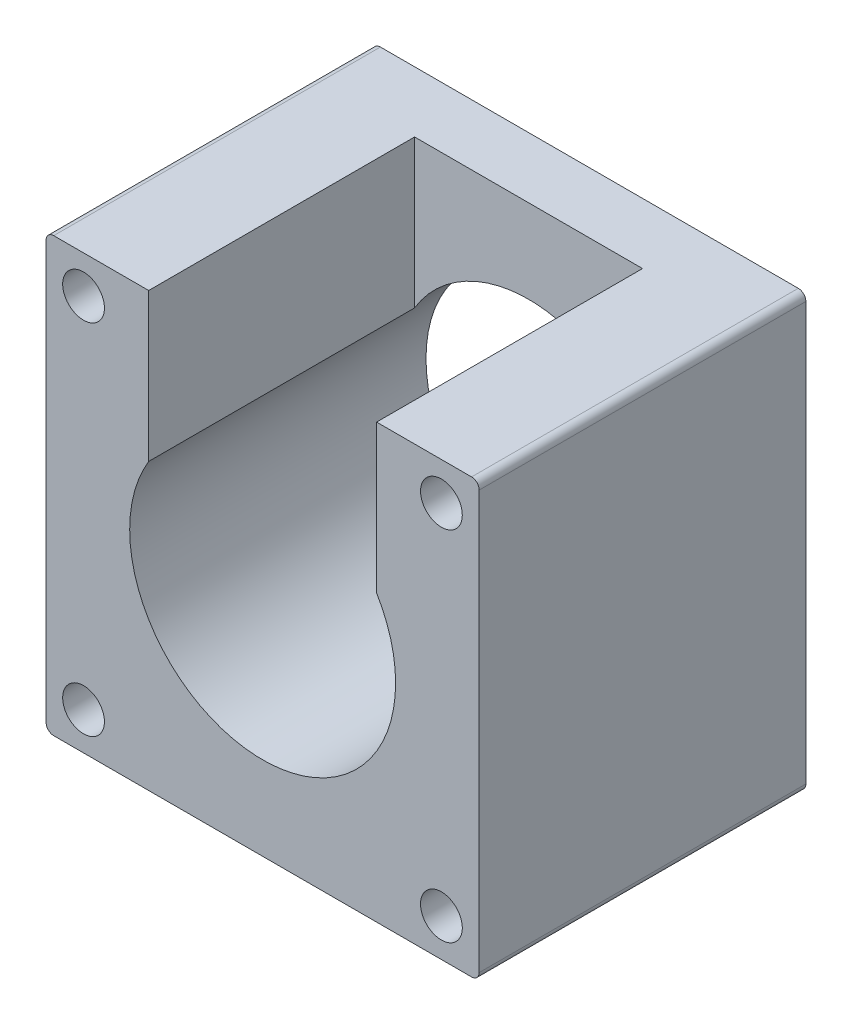
ISO-10303-21;
HEADER;
FILE_DESCRIPTION(('STEP AP214'),'2;1');
FILE_NAME('part.step','',(''),(''),'','','');
FILE_SCHEMA(('AUTOMOTIVE_DESIGN { 1 0 10303 214 1 1 1 1 }'));
ENDSEC;
DATA;
#1=APPLICATION_CONTEXT('core data for automotive mechanical design processes');
#2=APPLICATION_PROTOCOL_DEFINITION('international standard','automotive_design',2000,#1);
#3=PRODUCT_CONTEXT('',#1,'mechanical');
#4=PRODUCT('Part','Part','',(#3));
#5=PRODUCT_RELATED_PRODUCT_CATEGORY('part','',(#4));
#6=PRODUCT_DEFINITION_FORMATION('','',#4);
#7=PRODUCT_DEFINITION_CONTEXT('part definition',#1,'design');
#8=PRODUCT_DEFINITION('design','',#6,#7);
#9=PRODUCT_DEFINITION_SHAPE('','',#8);
#10=(LENGTH_UNIT() NAMED_UNIT(*) SI_UNIT(.MILLI.,.METRE.));
#11=(NAMED_UNIT(*) PLANE_ANGLE_UNIT() SI_UNIT($,.RADIAN.));
#12=(NAMED_UNIT(*) SI_UNIT($,.STERADIAN.) SOLID_ANGLE_UNIT());
#13=UNCERTAINTY_MEASURE_WITH_UNIT(LENGTH_MEASURE(1.E-05),#10,'distance_accuracy_value','');
#14=(GEOMETRIC_REPRESENTATION_CONTEXT(3) GLOBAL_UNCERTAINTY_ASSIGNED_CONTEXT((#13)) GLOBAL_UNIT_ASSIGNED_CONTEXT((#10,
#11,#12)) REPRESENTATION_CONTEXT('',''));
#15=CARTESIAN_POINT('',(0.,0.,0.));
#16=DIRECTION('',(0.,0.,1.));
#17=DIRECTION('',(1.,0.,0.));
#18=AXIS2_PLACEMENT_3D('',#15,#16,#17);
#19=CARTESIAN_POINT('',(28.5,28.5,43.));
#20=DIRECTION('',(0.,0.,-1.));
#21=DIRECTION('',(-1.,0.,0.));
#22=AXIS2_PLACEMENT_3D('',#19,#20,#21);
#23=CYLINDRICAL_SURFACE('',#22,17.5);
#24=DIRECTION('',(0.,0.,-1.));
#25=VECTOR('',#24,1.);
#26=CARTESIAN_POINT('',(13.5,37.51387818866,43.));
#27=LINE('',#26,#25);
#28=CARTESIAN_POINT('',(13.5,37.51387818866,43.));
#29=VERTEX_POINT('',#28);
#30=CARTESIAN_POINT('',(13.5,37.51387818866,7.99999999999999));
#31=VERTEX_POINT('',#30);
#32=EDGE_CURVE('E11',#29,#31,#27,.T.);
#33=ORIENTED_EDGE('',*,*,#32,.F.);
#34=CARTESIAN_POINT('',(28.5,28.5,43.));
#35=DIRECTION('',(0.,0.,1.));
#36=DIRECTION('',(1.,0.,0.));
#37=AXIS2_PLACEMENT_3D('',#34,#35,#36);
#38=CIRCLE('',#37,17.5);
#39=CARTESIAN_POINT('',(43.5,37.51387818866,43.));
#40=VERTEX_POINT('',#39);
#41=EDGE_CURVE('E148',#29,#40,#38,.T.);
#42=ORIENTED_EDGE('',*,*,#41,.T.);
#43=DIRECTION('',(0.,0.,-1.));
#44=VECTOR('',#43,1.);
#45=CARTESIAN_POINT('',(43.5,37.51387818866,43.));
#46=LINE('',#45,#44);
#47=CARTESIAN_POINT('',(43.5,37.51387818866,7.99999999999999));
#48=VERTEX_POINT('',#47);
#49=EDGE_CURVE('E175',#48,#40,#46,.F.);
#50=ORIENTED_EDGE('',*,*,#49,.F.);
#51=CARTESIAN_POINT('',(28.5,28.5,7.99999999999999));
#52=DIRECTION('',(0.,0.,-1.));
#53=DIRECTION('',(-1.,0.,0.));
#54=AXIS2_PLACEMENT_3D('',#51,#52,#53);
#55=CIRCLE('',#54,17.5);
#56=EDGE_CURVE('E41',#31,#48,#55,.T.);
#57=ORIENTED_EDGE('',*,*,#56,.F.);
#58=EDGE_LOOP('',(#33,#42,#50,#57));
#59=FACE_BOUND('',#58,.T.);
#60=CARTESIAN_POINT('',(28.5,28.5,4.));
#61=DIRECTION('',(0.,0.,-1.));
#62=DIRECTION('',(-1.,0.,0.));
#63=AXIS2_PLACEMENT_3D('',#60,#61,#62);
#64=CIRCLE('',#63,17.5);
#65=CARTESIAN_POINT('',(11.,28.5,4.));
#66=VERTEX_POINT('',#65);
#67=EDGE_CURVE('E36',#66,#66,#64,.T.);
#68=ORIENTED_EDGE('',*,*,#67,.T.);
#69=EDGE_LOOP('',(#68));
#70=FACE_BOUND('',#69,.T.);
#71=ADVANCED_FACE('F32',(#59,#70),#23,.F.);
#72=CARTESIAN_POINT('',(56.,1.,43.));
#73=DIRECTION('',(0.,0.,1.));
#74=DIRECTION('',(1.,0.,0.));
#75=AXIS2_PLACEMENT_3D('',#72,#73,#74);
#76=PLANE('',#75);
#77=DIRECTION('',(0.,1.,0.));
#78=VECTOR('',#77,1.);
#79=CARTESIAN_POINT('',(13.5,27.,43.));
#80=LINE('',#79,#78);
#81=CARTESIAN_POINT('',(13.5,57.,43.));
#82=VERTEX_POINT('',#81);
#83=EDGE_CURVE('E202',#29,#82,#80,.T.);
#84=ORIENTED_EDGE('',*,*,#83,.T.);
#85=DIRECTION('',(-1.,0.,0.));
#86=VECTOR('',#85,1.);
#87=CARTESIAN_POINT('',(1.,57.,43.));
#88=LINE('',#87,#86);
#89=CARTESIAN_POINT('',(1.,57.,43.));
#90=VERTEX_POINT('',#89);
#91=EDGE_CURVE('E238',#82,#90,#88,.T.);
#92=ORIENTED_EDGE('',*,*,#91,.T.);
#93=CARTESIAN_POINT('',(0.999999999999993,56.,43.));
#94=DIRECTION('',(0.,0.,1.));
#95=DIRECTION('',(-1.,0.,0.));
#96=AXIS2_PLACEMENT_3D('',#93,#94,#95);
#97=CIRCLE('',#96,1.);
#98=CARTESIAN_POINT('',(0.,56.,43.));
#99=VERTEX_POINT('',#98);
#100=EDGE_CURVE('E123',#90,#99,#97,.T.);
#101=ORIENTED_EDGE('',*,*,#100,.T.);
#102=DIRECTION('',(0.,-1.,0.));
#103=VECTOR('',#102,1.);
#104=CARTESIAN_POINT('',(0.,1.00000000000001,43.));
#105=LINE('',#104,#103);
#106=CARTESIAN_POINT('',(0.,1.00000000000001,43.));
#107=VERTEX_POINT('',#106);
#108=EDGE_CURVE('E114',#99,#107,#105,.T.);
#109=ORIENTED_EDGE('',*,*,#108,.T.);
#110=CARTESIAN_POINT('',(1.,1.,43.));
#111=DIRECTION('',(0.,0.,1.));
#112=DIRECTION('',(-1.,0.,0.));
#113=AXIS2_PLACEMENT_3D('',#110,#111,#112);
#114=CIRCLE('',#113,1.);
#115=CARTESIAN_POINT('',(1.00000000000001,0.,43.));
#116=VERTEX_POINT('',#115);
#117=EDGE_CURVE('E120',#107,#116,#114,.T.);
#118=ORIENTED_EDGE('',*,*,#117,.T.);
#119=DIRECTION('',(1.,0.,0.));
#120=VECTOR('',#119,1.);
#121=CARTESIAN_POINT('',(1.00000000000001,0.,43.));
#122=LINE('',#121,#120);
#123=CARTESIAN_POINT('',(56.,0.,43.));
#124=VERTEX_POINT('',#123);
#125=EDGE_CURVE('E57',#116,#124,#122,.T.);
#126=ORIENTED_EDGE('',*,*,#125,.T.);
#127=CARTESIAN_POINT('',(56.,1.,43.));
#128=DIRECTION('',(0.,0.,1.));
#129=DIRECTION('',(1.,0.,0.));
#130=AXIS2_PLACEMENT_3D('',#127,#128,#129);
#131=CIRCLE('',#130,1.);
#132=CARTESIAN_POINT('',(57.,1.00000000000001,43.));
#133=VERTEX_POINT('',#132);
#134=EDGE_CURVE('E160',#124,#133,#131,.T.);
#135=ORIENTED_EDGE('',*,*,#134,.T.);
#136=DIRECTION('',(0.,1.,0.));
#137=VECTOR('',#136,1.);
#138=CARTESIAN_POINT('',(57.,1.00000000000001,43.));
#139=LINE('',#138,#137);
#140=CARTESIAN_POINT('',(57.,56.,43.));
#141=VERTEX_POINT('',#140);
#142=EDGE_CURVE('E99',#133,#141,#139,.T.);
#143=ORIENTED_EDGE('',*,*,#142,.T.);
#144=CARTESIAN_POINT('',(56.,56.,43.));
#145=DIRECTION('',(0.,0.,1.));
#146=DIRECTION('',(-1.,0.,0.));
#147=AXIS2_PLACEMENT_3D('',#144,#145,#146);
#148=CIRCLE('',#147,1.);
#149=CARTESIAN_POINT('',(56.,57.,43.));
#150=VERTEX_POINT('',#149);
#151=EDGE_CURVE('E236',#141,#150,#148,.T.);
#152=ORIENTED_EDGE('',*,*,#151,.T.);
#153=CARTESIAN_POINT('',(43.5,57.,43.));
#154=VERTEX_POINT('',#153);
#155=EDGE_CURVE('E201',#150,#154,#88,.T.);
#156=ORIENTED_EDGE('',*,*,#155,.T.);
#157=DIRECTION('',(0.,1.,0.));
#158=VECTOR('',#157,1.);
#159=CARTESIAN_POINT('',(43.5,27.,43.));
#160=LINE('',#159,#158);
#161=EDGE_CURVE('E196',#40,#154,#160,.T.);
#162=ORIENTED_EDGE('',*,*,#161,.F.);
#163=ORIENTED_EDGE('',*,*,#41,.F.);
#164=EDGE_LOOP('',(#84,#92,#101,#109,#118,#126,#135,#143,#152,#156,#162,#163));
#165=FACE_BOUND('',#164,.T.);
#166=CARTESIAN_POINT('',(4.92665558238845,4.92665558238847,43.));
#167=DIRECTION('',(0.,0.,1.));
#168=DIRECTION('',(-1.,0.,0.));
#169=AXIS2_PLACEMENT_3D('',#166,#167,#168);
#170=CIRCLE('',#169,2.75);
#171=CARTESIAN_POINT('',(2.17665558238845,4.92665558238847,43.));
#172=VERTEX_POINT('',#171);
#173=EDGE_CURVE('E216',#172,#172,#170,.T.);
#174=ORIENTED_EDGE('',*,*,#173,.F.);
#175=EDGE_LOOP('',(#174));
#176=FACE_BOUND('',#175,.T.);
#177=CARTESIAN_POINT('',(4.92665558238845,52.0733444176115,43.));
#178=DIRECTION('',(0.,0.,1.));
#179=DIRECTION('',(1.,0.,0.));
#180=AXIS2_PLACEMENT_3D('',#177,#178,#179);
#181=CIRCLE('',#180,2.75);
#182=CARTESIAN_POINT('',(7.67665558238845,52.0733444176115,43.));
#183=VERTEX_POINT('',#182);
#184=EDGE_CURVE('E228',#183,#183,#181,.T.);
#185=ORIENTED_EDGE('',*,*,#184,.F.);
#186=EDGE_LOOP('',(#185));
#187=FACE_BOUND('',#186,.T.);
#188=CARTESIAN_POINT('',(52.0266324187858,52.0266324187858,43.));
#189=DIRECTION('',(0.,0.,1.));
#190=DIRECTION('',(1.,0.,0.));
#191=AXIS2_PLACEMENT_3D('',#188,#189,#190);
#192=CIRCLE('',#191,2.75);
#193=CARTESIAN_POINT('',(54.7766324187858,52.0266324187858,43.));
#194=VERTEX_POINT('',#193);
#195=EDGE_CURVE('E222',#194,#194,#192,.T.);
#196=ORIENTED_EDGE('',*,*,#195,.F.);
#197=EDGE_LOOP('',(#196));
#198=FACE_BOUND('',#197,.T.);
#199=CARTESIAN_POINT('',(52.0266324187858,4.97336758121422,43.));
#200=DIRECTION('',(0.,0.,1.));
#201=DIRECTION('',(-1.,0.,0.));
#202=AXIS2_PLACEMENT_3D('',#199,#200,#201);
#203=CIRCLE('',#202,2.75);
#204=CARTESIAN_POINT('',(49.2766324187858,4.97336758121422,43.));
#205=VERTEX_POINT('',#204);
#206=EDGE_CURVE('E209',#205,#205,#203,.T.);
#207=ORIENTED_EDGE('',*,*,#206,.F.);
#208=EDGE_LOOP('',(#207));
#209=FACE_BOUND('',#208,.T.);
#210=ADVANCED_FACE('F117',(#165,#176,#187,#198,#209),#76,.T.);
#211=CARTESIAN_POINT('',(56.,1.,0.));
#212=DIRECTION('',(0.,0.,1.));
#213=DIRECTION('',(1.,0.,0.));
#214=AXIS2_PLACEMENT_3D('',#211,#212,#213);
#215=PLANE('',#214);
#216=CARTESIAN_POINT('',(28.5,28.5,0.));
#217=DIRECTION('',(0.,0.,-1.));
#218=DIRECTION('',(-1.,0.,0.));
#219=AXIS2_PLACEMENT_3D('',#216,#217,#218);
#220=CIRCLE('',#219,22.5);
#221=CARTESIAN_POINT('',(5.99999999999999,28.5,0.));
#222=VERTEX_POINT('',#221);
#223=EDGE_CURVE('E393',#222,#222,#220,.T.);
#224=ORIENTED_EDGE('',*,*,#223,.F.);
#225=EDGE_LOOP('',(#224));
#226=FACE_BOUND('',#225,.T.);
#227=CARTESIAN_POINT('',(4.92665558238845,4.92665558238847,0.));
#228=DIRECTION('',(0.,0.,1.));
#229=DIRECTION('',(-1.,0.,0.));
#230=AXIS2_PLACEMENT_3D('',#227,#228,#229);
#231=CIRCLE('',#230,2.75);
#232=CARTESIAN_POINT('',(2.17665558238845,4.92665558238847,0.));
#233=VERTEX_POINT('',#232);
#234=EDGE_CURVE('E212',#233,#233,#231,.T.);
#235=ORIENTED_EDGE('',*,*,#234,.T.);
#236=EDGE_LOOP('',(#235));
#237=FACE_BOUND('',#236,.T.);
#238=CARTESIAN_POINT('',(4.92665558238845,52.0733444176115,0.));
#239=DIRECTION('',(0.,0.,1.));
#240=DIRECTION('',(1.,0.,0.));
#241=AXIS2_PLACEMENT_3D('',#238,#239,#240);
#242=CIRCLE('',#241,2.75);
#243=CARTESIAN_POINT('',(7.67665558238845,52.0733444176115,0.));
#244=VERTEX_POINT('',#243);
#245=EDGE_CURVE('E225',#244,#244,#242,.T.);
#246=ORIENTED_EDGE('',*,*,#245,.T.);
#247=EDGE_LOOP('',(#246));
#248=FACE_BOUND('',#247,.T.);
#249=CARTESIAN_POINT('',(56.,1.,0.));
#250=DIRECTION('',(0.,0.,1.));
#251=DIRECTION('',(1.,0.,0.));
#252=AXIS2_PLACEMENT_3D('',#249,#250,#251);
#253=CIRCLE('',#252,1.);
#254=CARTESIAN_POINT('',(56.,0.,0.));
#255=VERTEX_POINT('',#254);
#256=CARTESIAN_POINT('',(57.,1.00000000000001,0.));
#257=VERTEX_POINT('',#256);
#258=EDGE_CURVE('E144',#255,#257,#253,.T.);
#259=ORIENTED_EDGE('',*,*,#258,.F.);
#260=DIRECTION('',(1.,0.,0.));
#261=VECTOR('',#260,1.);
#262=CARTESIAN_POINT('',(1.00000000000001,0.,0.));
#263=LINE('',#262,#261);
#264=CARTESIAN_POINT('',(1.00000000000001,0.,0.));
#265=VERTEX_POINT('',#264);
#266=EDGE_CURVE('E90',#265,#255,#263,.T.);
#267=ORIENTED_EDGE('',*,*,#266,.F.);
#268=CARTESIAN_POINT('',(1.,1.,0.));
#269=DIRECTION('',(0.,0.,1.));
#270=DIRECTION('',(-1.,0.,0.));
#271=AXIS2_PLACEMENT_3D('',#268,#269,#270);
#272=CIRCLE('',#271,1.);
#273=CARTESIAN_POINT('',(0.,1.00000000000001,0.));
#274=VERTEX_POINT('',#273);
#275=EDGE_CURVE('E157',#274,#265,#272,.T.);
#276=ORIENTED_EDGE('',*,*,#275,.F.);
#277=DIRECTION('',(0.,-1.,0.));
#278=VECTOR('',#277,1.);
#279=CARTESIAN_POINT('',(0.,1.00000000000001,0.));
#280=LINE('',#279,#278);
#281=CARTESIAN_POINT('',(0.,56.,0.));
#282=VERTEX_POINT('',#281);
#283=EDGE_CURVE('E132',#282,#274,#280,.T.);
#284=ORIENTED_EDGE('',*,*,#283,.F.);
#285=CARTESIAN_POINT('',(0.999999999999993,56.,0.));
#286=DIRECTION('',(0.,0.,1.));
#287=DIRECTION('',(-1.,0.,0.));
#288=AXIS2_PLACEMENT_3D('',#285,#286,#287);
#289=CIRCLE('',#288,1.);
#290=CARTESIAN_POINT('',(1.,57.,0.));
#291=VERTEX_POINT('',#290);
#292=EDGE_CURVE('E154',#291,#282,#289,.T.);
#293=ORIENTED_EDGE('',*,*,#292,.F.);
#294=DIRECTION('',(-1.,0.,0.));
#295=VECTOR('',#294,1.);
#296=CARTESIAN_POINT('',(1.,57.,0.));
#297=LINE('',#296,#295);
#298=CARTESIAN_POINT('',(56.,57.,0.));
#299=VERTEX_POINT('',#298);
#300=EDGE_CURVE('E152',#299,#291,#297,.T.);
#301=ORIENTED_EDGE('',*,*,#300,.F.);
#302=CARTESIAN_POINT('',(56.,56.,0.));
#303=DIRECTION('',(0.,0.,1.));
#304=DIRECTION('',(-1.,0.,0.));
#305=AXIS2_PLACEMENT_3D('',#302,#303,#304);
#306=CIRCLE('',#305,1.);
#307=CARTESIAN_POINT('',(57.,56.,0.));
#308=VERTEX_POINT('',#307);
#309=EDGE_CURVE('E150',#308,#299,#306,.T.);
#310=ORIENTED_EDGE('',*,*,#309,.F.);
#311=DIRECTION('',(0.,1.,0.));
#312=VECTOR('',#311,1.);
#313=CARTESIAN_POINT('',(57.,1.00000000000001,0.));
#314=LINE('',#313,#312);
#315=EDGE_CURVE('E147',#257,#308,#314,.T.);
#316=ORIENTED_EDGE('',*,*,#315,.F.);
#317=EDGE_LOOP('',(#259,#267,#276,#284,#293,#301,#310,#316));
#318=FACE_BOUND('',#317,.T.);
#319=CARTESIAN_POINT('',(52.0266324187858,52.0266324187858,0.));
#320=DIRECTION('',(0.,0.,1.));
#321=DIRECTION('',(1.,0.,0.));
#322=AXIS2_PLACEMENT_3D('',#319,#320,#321);
#323=CIRCLE('',#322,2.75);
#324=CARTESIAN_POINT('',(54.7766324187858,52.0266324187858,0.));
#325=VERTEX_POINT('',#324);
#326=EDGE_CURVE('E219',#325,#325,#323,.T.);
#327=ORIENTED_EDGE('',*,*,#326,.T.);
#328=EDGE_LOOP('',(#327));
#329=FACE_BOUND('',#328,.T.);
#330=CARTESIAN_POINT('',(52.0266324187858,4.97336758121422,0.));
#331=DIRECTION('',(0.,0.,1.));
#332=DIRECTION('',(-1.,0.,0.));
#333=AXIS2_PLACEMENT_3D('',#330,#331,#332);
#334=CIRCLE('',#333,2.75);
#335=CARTESIAN_POINT('',(49.2766324187858,4.97336758121422,0.));
#336=VERTEX_POINT('',#335);
#337=EDGE_CURVE('E213',#336,#336,#334,.T.);
#338=ORIENTED_EDGE('',*,*,#337,.T.);
#339=EDGE_LOOP('',(#338));
#340=FACE_BOUND('',#339,.T.);
#341=ADVANCED_FACE('F252',(#226,#237,#248,#318,#329,#340),#215,.F.);
#342=CARTESIAN_POINT('',(56.,1.,43.));
#343=DIRECTION('',(0.,0.,-1.));
#344=DIRECTION('',(-1.,0.,0.));
#345=AXIS2_PLACEMENT_3D('',#342,#343,#344);
#346=CYLINDRICAL_SURFACE('',#345,1.);
#347=ORIENTED_EDGE('',*,*,#258,.T.);
#348=DIRECTION('',(0.,0.,-1.));
#349=VECTOR('',#348,1.);
#350=CARTESIAN_POINT('',(57.,1.00000000000001,43.));
#351=LINE('',#350,#349);
#352=EDGE_CURVE('E173',#133,#257,#351,.T.);
#353=ORIENTED_EDGE('',*,*,#352,.F.);
#354=ORIENTED_EDGE('',*,*,#134,.F.);
#355=DIRECTION('',(0.,0.,-1.));
#356=VECTOR('',#355,1.);
#357=CARTESIAN_POINT('',(56.,0.,43.));
#358=LINE('',#357,#356);
#359=EDGE_CURVE('E140',#124,#255,#358,.T.);
#360=ORIENTED_EDGE('',*,*,#359,.T.);
#361=EDGE_LOOP('',(#347,#353,#354,#360));
#362=FACE_BOUND('',#361,.T.);
#363=ADVANCED_FACE('F34',(#362),#346,.T.);
#364=CARTESIAN_POINT('',(57.,1.00000000000001,43.));
#365=DIRECTION('',(-1.,0.,0.));
#366=DIRECTION('',(0.,-1.,0.));
#367=AXIS2_PLACEMENT_3D('',#364,#365,#366);
#368=PLANE('',#367);
#369=ORIENTED_EDGE('',*,*,#315,.T.);
#370=DIRECTION('',(0.,0.,-1.));
#371=VECTOR('',#370,1.);
#372=CARTESIAN_POINT('',(57.,56.,43.));
#373=LINE('',#372,#371);
#374=EDGE_CURVE('E170',#141,#308,#373,.T.);
#375=ORIENTED_EDGE('',*,*,#374,.F.);
#376=ORIENTED_EDGE('',*,*,#142,.F.);
#377=ORIENTED_EDGE('',*,*,#352,.T.);
#378=EDGE_LOOP('',(#369,#375,#376,#377));
#379=FACE_BOUND('',#378,.T.);
#380=ADVANCED_FACE('F260',(#379),#368,.F.);
#381=CARTESIAN_POINT('',(56.,56.,43.));
#382=DIRECTION('',(0.,0.,-1.));
#383=DIRECTION('',(-1.,0.,0.));
#384=AXIS2_PLACEMENT_3D('',#381,#382,#383);
#385=CYLINDRICAL_SURFACE('',#384,1.);
#386=ORIENTED_EDGE('',*,*,#309,.T.);
#387=DIRECTION('',(0.,0.,-1.));
#388=VECTOR('',#387,1.);
#389=CARTESIAN_POINT('',(56.,57.,43.));
#390=LINE('',#389,#388);
#391=EDGE_CURVE('E167',#150,#299,#390,.T.);
#392=ORIENTED_EDGE('',*,*,#391,.F.);
#393=ORIENTED_EDGE('',*,*,#151,.F.);
#394=ORIENTED_EDGE('',*,*,#374,.T.);
#395=EDGE_LOOP('',(#386,#392,#393,#394));
#396=FACE_BOUND('',#395,.T.);
#397=ADVANCED_FACE('F263',(#396),#385,.T.);
#398=CARTESIAN_POINT('',(1.,57.,43.));
#399=DIRECTION('',(0.,-1.,0.));
#400=DIRECTION('',(0.,0.,-1.));
#401=AXIS2_PLACEMENT_3D('',#398,#399,#400);
#402=PLANE('',#401);
#403=ORIENTED_EDGE('',*,*,#91,.F.);
#404=DIRECTION('',(0.,0.,1.));
#405=VECTOR('',#404,1.);
#406=CARTESIAN_POINT('',(13.5,57.,43.));
#407=LINE('',#406,#405);
#408=CARTESIAN_POINT('',(13.5,57.,7.99999999999999));
#409=VERTEX_POINT('',#408);
#410=EDGE_CURVE('E267',#409,#82,#407,.T.);
#411=ORIENTED_EDGE('',*,*,#410,.F.);
#412=DIRECTION('',(-1.,0.,0.));
#413=VECTOR('',#412,1.);
#414=CARTESIAN_POINT('',(13.5,57.,7.99999999999999));
#415=LINE('',#414,#413);
#416=CARTESIAN_POINT('',(43.5,57.,7.99999999999999));
#417=VERTEX_POINT('',#416);
#418=EDGE_CURVE('E205',#417,#409,#415,.T.);
#419=ORIENTED_EDGE('',*,*,#418,.F.);
#420=DIRECTION('',(0.,0.,-1.));
#421=VECTOR('',#420,1.);
#422=CARTESIAN_POINT('',(43.5,57.,43.));
#423=LINE('',#422,#421);
#424=EDGE_CURVE('E265',#154,#417,#423,.T.);
#425=ORIENTED_EDGE('',*,*,#424,.F.);
#426=ORIENTED_EDGE('',*,*,#155,.F.);
#427=ORIENTED_EDGE('',*,*,#391,.T.);
#428=ORIENTED_EDGE('',*,*,#300,.T.);
#429=DIRECTION('',(0.,0.,-1.));
#430=VECTOR('',#429,1.);
#431=CARTESIAN_POINT('',(1.,57.,43.));
#432=LINE('',#431,#430);
#433=EDGE_CURVE('E164',#90,#291,#432,.T.);
#434=ORIENTED_EDGE('',*,*,#433,.F.);
#435=EDGE_LOOP('',(#403,#411,#419,#425,#426,#427,#428,#434));
#436=FACE_BOUND('',#435,.T.);
#437=ADVANCED_FACE('F245',(#436),#402,.F.);
#438=CARTESIAN_POINT('',(0.999999999999993,56.,43.));
#439=DIRECTION('',(0.,0.,-1.));
#440=DIRECTION('',(-1.,0.,0.));
#441=AXIS2_PLACEMENT_3D('',#438,#439,#440);
#442=CYLINDRICAL_SURFACE('',#441,1.);
#443=ORIENTED_EDGE('',*,*,#292,.T.);
#444=DIRECTION('',(0.,0.,-1.));
#445=VECTOR('',#444,1.);
#446=CARTESIAN_POINT('',(0.,56.,43.));
#447=LINE('',#446,#445);
#448=EDGE_CURVE('E135',#99,#282,#447,.T.);
#449=ORIENTED_EDGE('',*,*,#448,.F.);
#450=ORIENTED_EDGE('',*,*,#100,.F.);
#451=ORIENTED_EDGE('',*,*,#433,.T.);
#452=EDGE_LOOP('',(#443,#449,#450,#451));
#453=FACE_BOUND('',#452,.T.);
#454=ADVANCED_FACE('F249',(#453),#442,.T.);
#455=CARTESIAN_POINT('',(0.,1.00000000000001,43.));
#456=DIRECTION('',(1.,0.,0.));
#457=DIRECTION('',(0.,1.,0.));
#458=AXIS2_PLACEMENT_3D('',#455,#456,#457);
#459=PLANE('',#458);
#460=ORIENTED_EDGE('',*,*,#283,.T.);
#461=DIRECTION('',(0.,0.,-1.));
#462=VECTOR('',#461,1.);
#463=CARTESIAN_POINT('',(0.,1.00000000000001,43.));
#464=LINE('',#463,#462);
#465=EDGE_CURVE('E129',#107,#274,#464,.T.);
#466=ORIENTED_EDGE('',*,*,#465,.F.);
#467=ORIENTED_EDGE('',*,*,#108,.F.);
#468=ORIENTED_EDGE('',*,*,#448,.T.);
#469=EDGE_LOOP('',(#460,#466,#467,#468));
#470=FACE_BOUND('',#469,.T.);
#471=ADVANCED_FACE('F130',(#470),#459,.F.);
#472=CARTESIAN_POINT('',(1.,1.,43.));
#473=DIRECTION('',(0.,0.,-1.));
#474=DIRECTION('',(-1.,0.,0.));
#475=AXIS2_PLACEMENT_3D('',#472,#473,#474);
#476=CYLINDRICAL_SURFACE('',#475,1.);
#477=ORIENTED_EDGE('',*,*,#275,.T.);
#478=DIRECTION('',(0.,0.,-1.));
#479=VECTOR('',#478,1.);
#480=CARTESIAN_POINT('',(1.00000000000001,0.,43.));
#481=LINE('',#480,#479);
#482=EDGE_CURVE('E136',#116,#265,#481,.T.);
#483=ORIENTED_EDGE('',*,*,#482,.F.);
#484=ORIENTED_EDGE('',*,*,#117,.F.);
#485=ORIENTED_EDGE('',*,*,#465,.T.);
#486=EDGE_LOOP('',(#477,#483,#484,#485));
#487=FACE_BOUND('',#486,.T.);
#488=ADVANCED_FACE('F138',(#487),#476,.T.);
#489=CARTESIAN_POINT('',(1.00000000000001,0.,43.));
#490=DIRECTION('',(0.,1.,0.));
#491=DIRECTION('',(0.,0.,1.));
#492=AXIS2_PLACEMENT_3D('',#489,#490,#491);
#493=PLANE('',#492);
#494=ORIENTED_EDGE('',*,*,#266,.T.);
#495=ORIENTED_EDGE('',*,*,#359,.F.);
#496=ORIENTED_EDGE('',*,*,#125,.F.);
#497=ORIENTED_EDGE('',*,*,#482,.T.);
#498=EDGE_LOOP('',(#494,#495,#496,#497));
#499=FACE_BOUND('',#498,.T.);
#500=ADVANCED_FACE('F254',(#499),#493,.F.);
#501=CARTESIAN_POINT('',(4.92665558238845,52.0733444176115,43.));
#502=DIRECTION('',(0.,0.,-1.));
#503=DIRECTION('',(-1.,0.,0.));
#504=AXIS2_PLACEMENT_3D('',#501,#502,#503);
#505=CYLINDRICAL_SURFACE('',#504,2.75);
#506=ORIENTED_EDGE('',*,*,#184,.T.);
#507=EDGE_LOOP('',(#506));
#508=FACE_BOUND('',#507,.T.);
#509=ORIENTED_EDGE('',*,*,#245,.F.);
#510=EDGE_LOOP('',(#509));
#511=FACE_BOUND('',#510,.T.);
#512=ADVANCED_FACE('F299',(#508,#511),#505,.F.);
#513=CARTESIAN_POINT('',(52.0266324187858,52.0266324187858,43.));
#514=DIRECTION('',(0.,0.,-1.));
#515=DIRECTION('',(-1.,0.,0.));
#516=AXIS2_PLACEMENT_3D('',#513,#514,#515);
#517=CYLINDRICAL_SURFACE('',#516,2.75);
#518=ORIENTED_EDGE('',*,*,#195,.T.);
#519=EDGE_LOOP('',(#518));
#520=FACE_BOUND('',#519,.T.);
#521=ORIENTED_EDGE('',*,*,#326,.F.);
#522=EDGE_LOOP('',(#521));
#523=FACE_BOUND('',#522,.T.);
#524=ADVANCED_FACE('F404',(#520,#523),#517,.F.);
#525=CARTESIAN_POINT('',(4.92665558238845,4.92665558238847,43.));
#526=DIRECTION('',(0.,0.,-1.));
#527=DIRECTION('',(-1.,0.,0.));
#528=AXIS2_PLACEMENT_3D('',#525,#526,#527);
#529=CYLINDRICAL_SURFACE('',#528,2.75);
#530=ORIENTED_EDGE('',*,*,#173,.T.);
#531=EDGE_LOOP('',(#530));
#532=FACE_BOUND('',#531,.T.);
#533=ORIENTED_EDGE('',*,*,#234,.F.);
#534=EDGE_LOOP('',(#533));
#535=FACE_BOUND('',#534,.T.);
#536=ADVANCED_FACE('F288',(#532,#535),#529,.F.);
#537=CARTESIAN_POINT('',(52.0266324187858,4.97336758121422,43.));
#538=DIRECTION('',(0.,0.,-1.));
#539=DIRECTION('',(-1.,0.,0.));
#540=AXIS2_PLACEMENT_3D('',#537,#538,#539);
#541=CYLINDRICAL_SURFACE('',#540,2.75);
#542=ORIENTED_EDGE('',*,*,#206,.T.);
#543=EDGE_LOOP('',(#542));
#544=FACE_BOUND('',#543,.T.);
#545=ORIENTED_EDGE('',*,*,#337,.F.);
#546=EDGE_LOOP('',(#545));
#547=FACE_BOUND('',#546,.T.);
#548=ADVANCED_FACE('F281',(#544,#547),#541,.F.);
#549=CARTESIAN_POINT('',(13.5,27.,43.));
#550=DIRECTION('',(-1.,0.,0.));
#551=DIRECTION('',(0.,0.,1.));
#552=AXIS2_PLACEMENT_3D('',#549,#550,#551);
#553=PLANE('',#552);
#554=ORIENTED_EDGE('',*,*,#32,.T.);
#555=DIRECTION('',(0.,1.,0.));
#556=VECTOR('',#555,1.);
#557=CARTESIAN_POINT('',(13.5,27.,7.99999999999999));
#558=LINE('',#557,#556);
#559=EDGE_CURVE('E185',#31,#409,#558,.T.);
#560=ORIENTED_EDGE('',*,*,#559,.T.);
#561=ORIENTED_EDGE('',*,*,#410,.T.);
#562=ORIENTED_EDGE('',*,*,#83,.F.);
#563=EDGE_LOOP('',(#554,#560,#561,#562));
#564=FACE_BOUND('',#563,.T.);
#565=ADVANCED_FACE('F275',(#564),#553,.F.);
#566=CARTESIAN_POINT('',(13.5,27.,7.99999999999999));
#567=DIRECTION('',(0.,0.,-1.));
#568=DIRECTION('',(-1.,0.,0.));
#569=AXIS2_PLACEMENT_3D('',#566,#567,#568);
#570=PLANE('',#569);
#571=ORIENTED_EDGE('',*,*,#56,.T.);
#572=DIRECTION('',(0.,1.,0.));
#573=VECTOR('',#572,1.);
#574=CARTESIAN_POINT('',(43.5,27.,7.99999999999999));
#575=LINE('',#574,#573);
#576=EDGE_CURVE('E48',#48,#417,#575,.T.);
#577=ORIENTED_EDGE('',*,*,#576,.T.);
#578=ORIENTED_EDGE('',*,*,#418,.T.);
#579=ORIENTED_EDGE('',*,*,#559,.F.);
#580=EDGE_LOOP('',(#571,#577,#578,#579));
#581=FACE_BOUND('',#580,.T.);
#582=ADVANCED_FACE('F181',(#581),#570,.F.);
#583=CARTESIAN_POINT('',(43.5,27.,43.));
#584=DIRECTION('',(1.,0.,0.));
#585=DIRECTION('',(0.,0.,-1.));
#586=AXIS2_PLACEMENT_3D('',#583,#584,#585);
#587=PLANE('',#586);
#588=ORIENTED_EDGE('',*,*,#49,.T.);
#589=ORIENTED_EDGE('',*,*,#161,.T.);
#590=ORIENTED_EDGE('',*,*,#424,.T.);
#591=ORIENTED_EDGE('',*,*,#576,.F.);
#592=EDGE_LOOP('',(#588,#589,#590,#591));
#593=FACE_BOUND('',#592,.T.);
#594=ADVANCED_FACE('F194',(#593),#587,.F.);
#595=CARTESIAN_POINT('',(28.5,28.5,4.));
#596=DIRECTION('',(0.,0.,-1.));
#597=DIRECTION('',(-1.,0.,0.));
#598=AXIS2_PLACEMENT_3D('',#595,#596,#597);
#599=CYLINDRICAL_SURFACE('',#598,22.5);
#600=CARTESIAN_POINT('',(28.5,28.5,4.));
#601=DIRECTION('',(0.,0.,-1.));
#602=DIRECTION('',(-1.,0.,0.));
#603=AXIS2_PLACEMENT_3D('',#600,#601,#602);
#604=CIRCLE('',#603,22.5);
#605=CARTESIAN_POINT('',(5.99999999999999,28.5,4.));
#606=VERTEX_POINT('',#605);
#607=EDGE_CURVE('E392',#606,#606,#604,.T.);
#608=ORIENTED_EDGE('',*,*,#607,.F.);
#609=EDGE_LOOP('',(#608));
#610=FACE_BOUND('',#609,.T.);
#611=ORIENTED_EDGE('',*,*,#223,.T.);
#612=EDGE_LOOP('',(#611));
#613=FACE_BOUND('',#612,.T.);
#614=ADVANCED_FACE('F361',(#610,#613),#599,.F.);
#615=CARTESIAN_POINT('',(28.5,28.5,4.));
#616=DIRECTION('',(0.,0.,-1.));
#617=DIRECTION('',(-1.,0.,0.));
#618=AXIS2_PLACEMENT_3D('',#615,#616,#617);
#619=PLANE('',#618);
#620=ORIENTED_EDGE('',*,*,#67,.F.);
#621=EDGE_LOOP('',(#620));
#622=FACE_BOUND('',#621,.T.);
#623=ORIENTED_EDGE('',*,*,#607,.T.);
#624=EDGE_LOOP('',(#623));
#625=FACE_BOUND('',#624,.T.);
#626=ADVANCED_FACE('F374',(#622,#625),#619,.T.);
#627=CLOSED_SHELL('',(#71,#210,#341,#363,#380,#397,#437,#454,#471,#488,#500,#512,#524,#536,#548,
#565,#582,#594,#614,#626));
#628=MANIFOLD_SOLID_BREP('B2',#627);
#629=ADVANCED_BREP_SHAPE_REPRESENTATION('',(#18,#628),#14);
#630=SHAPE_DEFINITION_REPRESENTATION(#9,#629);
ENDSEC;
END-ISO-10303-21;
